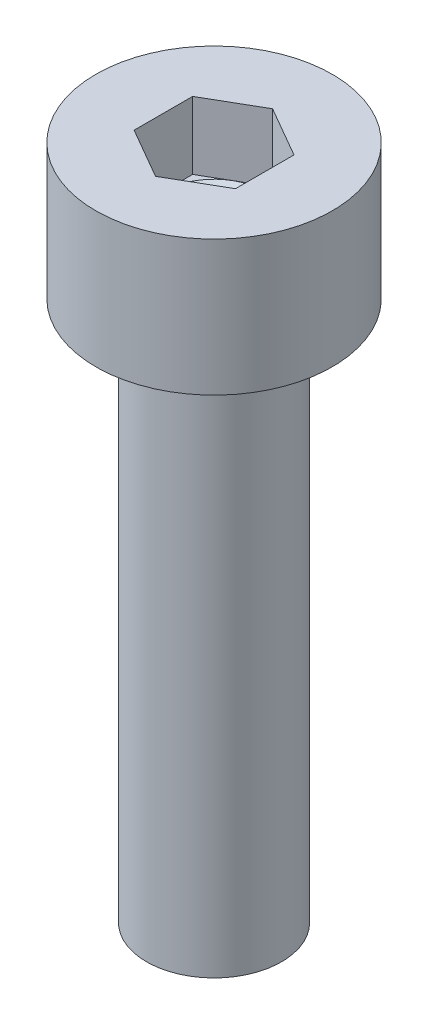
ISO-10303-21;
HEADER;
FILE_DESCRIPTION(('STEP AP214'),'2;1');
FILE_NAME('part.step','',(''),(''),'','','');
FILE_SCHEMA(('AUTOMOTIVE_DESIGN { 1 0 10303 214 1 1 1 1 }'));
ENDSEC;
DATA;
#1=APPLICATION_CONTEXT('core data for automotive mechanical design processes');
#2=APPLICATION_PROTOCOL_DEFINITION('international standard','automotive_design',2000,#1);
#3=PRODUCT_CONTEXT('',#1,'mechanical');
#4=PRODUCT('Part','Part','',(#3));
#5=PRODUCT_RELATED_PRODUCT_CATEGORY('part','',(#4));
#6=PRODUCT_DEFINITION_FORMATION('','',#4);
#7=PRODUCT_DEFINITION_CONTEXT('part definition',#1,'design');
#8=PRODUCT_DEFINITION('design','',#6,#7);
#9=PRODUCT_DEFINITION_SHAPE('','',#8);
#10=(LENGTH_UNIT() NAMED_UNIT(*) SI_UNIT(.MILLI.,.METRE.));
#11=(NAMED_UNIT(*) PLANE_ANGLE_UNIT() SI_UNIT($,.RADIAN.));
#12=(NAMED_UNIT(*) SI_UNIT($,.STERADIAN.) SOLID_ANGLE_UNIT());
#13=UNCERTAINTY_MEASURE_WITH_UNIT(LENGTH_MEASURE(1.E-05),#10,'distance_accuracy_value','');
#14=(GEOMETRIC_REPRESENTATION_CONTEXT(3) GLOBAL_UNCERTAINTY_ASSIGNED_CONTEXT((#13)) GLOBAL_UNIT_ASSIGNED_CONTEXT((#10,
#11,#12)) REPRESENTATION_CONTEXT('',''));
#15=CARTESIAN_POINT('',(0.,0.,0.));
#16=DIRECTION('',(0.,0.,1.));
#17=DIRECTION('',(1.,0.,0.));
#18=AXIS2_PLACEMENT_3D('',#15,#16,#17);
#19=CARTESIAN_POINT('',(0.,0.,0.));
#20=DIRECTION('',(0.,-1.,0.));
#21=DIRECTION('',(1.,0.,0.));
#22=AXIS2_PLACEMENT_3D('',#19,#20,#21);
#23=PLANE('',#22);
#24=CARTESIAN_POINT('',(0.,0.,0.));
#25=DIRECTION('',(0.,1.,0.));
#26=DIRECTION('',(-1.,0.,0.));
#27=AXIS2_PLACEMENT_3D('',#24,#25,#26);
#28=CIRCLE('',#27,3.5);
#29=CARTESIAN_POINT('',(-3.5,0.,0.));
#30=VERTEX_POINT('',#29);
#31=EDGE_CURVE('E11',#30,#30,#28,.T.);
#32=ORIENTED_EDGE('',*,*,#31,.T.);
#33=EDGE_LOOP('',(#32));
#34=FACE_BOUND('',#33,.T.);
#35=DIRECTION('',(-0.866025403784439,0.,0.5));
#36=VECTOR('',#35,1.);
#37=CARTESIAN_POINT('',(0.,0.,-1.73205080756888));
#38=LINE('',#37,#36);
#39=CARTESIAN_POINT('',(0.,0.,-1.73205080756888));
#40=VERTEX_POINT('',#39);
#41=CARTESIAN_POINT('',(-1.5,0.,-0.866025403784439));
#42=VERTEX_POINT('',#41);
#43=EDGE_CURVE('E148',#40,#42,#38,.T.);
#44=ORIENTED_EDGE('',*,*,#43,.F.);
#45=DIRECTION('',(-0.866025403784439,0.,-0.5));
#46=VECTOR('',#45,1.);
#47=CARTESIAN_POINT('',(1.5,0.,-0.866025403784439));
#48=LINE('',#47,#46);
#49=CARTESIAN_POINT('',(1.5,0.,-0.866025403784439));
#50=VERTEX_POINT('',#49);
#51=EDGE_CURVE('E49',#50,#40,#48,.T.);
#52=ORIENTED_EDGE('',*,*,#51,.F.);
#53=DIRECTION('',(0.,0.,-1.));
#54=VECTOR('',#53,1.);
#55=CARTESIAN_POINT('',(1.5,0.,0.866025403784439));
#56=LINE('',#55,#54);
#57=CARTESIAN_POINT('',(1.5,0.,0.866025403784439));
#58=VERTEX_POINT('',#57);
#59=EDGE_CURVE('E119',#58,#50,#56,.T.);
#60=ORIENTED_EDGE('',*,*,#59,.F.);
#61=DIRECTION('',(0.866025403784439,0.,-0.5));
#62=VECTOR('',#61,1.);
#63=CARTESIAN_POINT('',(0.,0.,1.73205080756888));
#64=LINE('',#63,#62);
#65=CARTESIAN_POINT('',(0.,0.,1.73205080756888));
#66=VERTEX_POINT('',#65);
#67=EDGE_CURVE('E155',#66,#58,#64,.T.);
#68=ORIENTED_EDGE('',*,*,#67,.F.);
#69=DIRECTION('',(0.866025403784439,0.,0.5));
#70=VECTOR('',#69,1.);
#71=CARTESIAN_POINT('',(-1.5,0.,0.866025403784439));
#72=LINE('',#71,#70);
#73=CARTESIAN_POINT('',(-1.5,0.,0.866025403784439));
#74=VERTEX_POINT('',#73);
#75=EDGE_CURVE('E152',#74,#66,#72,.T.);
#76=ORIENTED_EDGE('',*,*,#75,.F.);
#77=DIRECTION('',(0.,0.,1.));
#78=VECTOR('',#77,1.);
#79=CARTESIAN_POINT('',(-1.5,0.,-0.866025403784439));
#80=LINE('',#79,#78);
#81=EDGE_CURVE('E150',#42,#74,#80,.T.);
#82=ORIENTED_EDGE('',*,*,#81,.F.);
#83=EDGE_LOOP('',(#44,#52,#60,#68,#76,#82));
#84=FACE_BOUND('',#83,.T.);
#85=ADVANCED_FACE('F35',(#34,#84),#23,.F.);
#86=CARTESIAN_POINT('',(0.,0.,0.));
#87=DIRECTION('',(0.,1.,0.));
#88=DIRECTION('',(-1.,0.,0.));
#89=AXIS2_PLACEMENT_3D('',#86,#87,#88);
#90=CYLINDRICAL_SURFACE('',#89,3.5);
#91=ORIENTED_EDGE('',*,*,#31,.F.);
#92=EDGE_LOOP('',(#91));
#93=FACE_BOUND('',#92,.T.);
#94=CARTESIAN_POINT('',(0.,-4.,0.));
#95=DIRECTION('',(0.,1.,0.));
#96=DIRECTION('',(-1.,0.,0.));
#97=AXIS2_PLACEMENT_3D('',#94,#95,#96);
#98=CIRCLE('',#97,3.5);
#99=CARTESIAN_POINT('',(-3.5,-4.,0.));
#100=VERTEX_POINT('',#99);
#101=EDGE_CURVE('E42',#100,#100,#98,.T.);
#102=ORIENTED_EDGE('',*,*,#101,.T.);
#103=EDGE_LOOP('',(#102));
#104=FACE_BOUND('',#103,.T.);
#105=ADVANCED_FACE('F184',(#93,#104),#90,.T.);
#106=CARTESIAN_POINT('',(3.5,-4.,0.));
#107=DIRECTION('',(0.,1.,0.));
#108=DIRECTION('',(-1.,0.,0.));
#109=AXIS2_PLACEMENT_3D('',#106,#107,#108);
#110=PLANE('',#109);
#111=ORIENTED_EDGE('',*,*,#101,.F.);
#112=EDGE_LOOP('',(#111));
#113=FACE_BOUND('',#112,.T.);
#114=CARTESIAN_POINT('',(0.,-4.,0.));
#115=DIRECTION('',(0.,1.,0.));
#116=DIRECTION('',(-1.,0.,0.));
#117=AXIS2_PLACEMENT_3D('',#114,#115,#116);
#118=CIRCLE('',#117,2.);
#119=CARTESIAN_POINT('',(-2.,-4.,0.));
#120=VERTEX_POINT('',#119);
#121=EDGE_CURVE('E179',#120,#120,#118,.T.);
#122=ORIENTED_EDGE('',*,*,#121,.T.);
#123=EDGE_LOOP('',(#122));
#124=FACE_BOUND('',#123,.T.);
#125=ADVANCED_FACE('F186',(#113,#124),#110,.F.);
#126=CARTESIAN_POINT('',(0.,0.,0.));
#127=DIRECTION('',(0.,1.,0.));
#128=DIRECTION('',(-1.,0.,0.));
#129=AXIS2_PLACEMENT_3D('',#126,#127,#128);
#130=CYLINDRICAL_SURFACE('',#129,2.);
#131=ORIENTED_EDGE('',*,*,#121,.F.);
#132=EDGE_LOOP('',(#131));
#133=FACE_BOUND('',#132,.T.);
#134=CARTESIAN_POINT('',(0.,-20.,0.));
#135=DIRECTION('',(0.,1.,0.));
#136=DIRECTION('',(-1.,0.,0.));
#137=AXIS2_PLACEMENT_3D('',#134,#135,#136);
#138=CIRCLE('',#137,2.);
#139=CARTESIAN_POINT('',(-2.,-20.,0.));
#140=VERTEX_POINT('',#139);
#141=EDGE_CURVE('E175',#140,#140,#138,.T.);
#142=ORIENTED_EDGE('',*,*,#141,.T.);
#143=EDGE_LOOP('',(#142));
#144=FACE_BOUND('',#143,.T.);
#145=ADVANCED_FACE('F189',(#133,#144),#130,.T.);
#146=CARTESIAN_POINT('',(2.,-20.,0.));
#147=DIRECTION('',(0.,1.,0.));
#148=DIRECTION('',(-1.,0.,0.));
#149=AXIS2_PLACEMENT_3D('',#146,#147,#148);
#150=PLANE('',#149);
#151=ORIENTED_EDGE('',*,*,#141,.F.);
#152=EDGE_LOOP('',(#151));
#153=FACE_BOUND('',#152,.T.);
#154=ADVANCED_FACE('F195',(#153),#150,.F.);
#155=CARTESIAN_POINT('',(1.5,-2.,-0.866025403784439));
#156=DIRECTION('',(0.5,0.,-0.866025403784439));
#157=DIRECTION('',(-0.866025403784439,0.,-0.5));
#158=AXIS2_PLACEMENT_3D('',#155,#156,#157);
#159=PLANE('',#158);
#160=DIRECTION('',(-0.866025403784439,0.,-0.5));
#161=VECTOR('',#160,1.);
#162=CARTESIAN_POINT('',(1.5,-2.,-0.866025403784439));
#163=LINE('',#162,#161);
#164=CARTESIAN_POINT('',(1.5,-2.,-0.866025403784439));
#165=VERTEX_POINT('',#164);
#166=CARTESIAN_POINT('',(0.75,-2.,-1.29903810567666));
#167=VERTEX_POINT('',#166);
#168=EDGE_CURVE('E118',#165,#167,#163,.T.);
#169=ORIENTED_EDGE('',*,*,#168,.F.);
#170=DIRECTION('',(0.,1.,0.));
#171=VECTOR('',#170,1.);
#172=CARTESIAN_POINT('',(1.5,-2.,-0.866025403784439));
#173=LINE('',#172,#171);
#174=EDGE_CURVE('E158',#165,#50,#173,.T.);
#175=ORIENTED_EDGE('',*,*,#174,.T.);
#176=ORIENTED_EDGE('',*,*,#51,.T.);
#177=DIRECTION('',(0.,1.,0.));
#178=VECTOR('',#177,1.);
#179=CARTESIAN_POINT('',(0.,-2.,-1.73205080756888));
#180=LINE('',#179,#178);
#181=CARTESIAN_POINT('',(0.,-2.,-1.73205080756888));
#182=VERTEX_POINT('',#181);
#183=EDGE_CURVE('E121',#182,#40,#180,.T.);
#184=ORIENTED_EDGE('',*,*,#183,.F.);
#185=EDGE_CURVE('E110',#167,#182,#163,.T.);
#186=ORIENTED_EDGE('',*,*,#185,.F.);
#187=EDGE_LOOP('',(#169,#175,#176,#184,#186));
#188=FACE_BOUND('',#187,.T.);
#189=ADVANCED_FACE('F122',(#188),#159,.F.);
#190=CARTESIAN_POINT('',(1.5,-2.,0.866025403784439));
#191=DIRECTION('',(1.,0.,0.));
#192=DIRECTION('',(0.,0.,-1.));
#193=AXIS2_PLACEMENT_3D('',#190,#191,#192);
#194=PLANE('',#193);
#195=DIRECTION('',(0.,0.,-1.));
#196=VECTOR('',#195,1.);
#197=CARTESIAN_POINT('',(1.5,-2.,0.866025403784439));
#198=LINE('',#197,#196);
#199=CARTESIAN_POINT('',(1.5,-2.,0.866025403784439));
#200=VERTEX_POINT('',#199);
#201=CARTESIAN_POINT('',(1.5,-2.,0.));
#202=VERTEX_POINT('',#201);
#203=EDGE_CURVE('E126',#200,#202,#198,.T.);
#204=ORIENTED_EDGE('',*,*,#203,.F.);
#205=DIRECTION('',(0.,1.,0.));
#206=VECTOR('',#205,1.);
#207=CARTESIAN_POINT('',(1.5,-2.,0.866025403784439));
#208=LINE('',#207,#206);
#209=EDGE_CURVE('E161',#200,#58,#208,.T.);
#210=ORIENTED_EDGE('',*,*,#209,.T.);
#211=ORIENTED_EDGE('',*,*,#59,.T.);
#212=ORIENTED_EDGE('',*,*,#174,.F.);
#213=EDGE_CURVE('E144',#202,#165,#198,.T.);
#214=ORIENTED_EDGE('',*,*,#213,.F.);
#215=EDGE_LOOP('',(#204,#210,#211,#212,#214));
#216=FACE_BOUND('',#215,.T.);
#217=ADVANCED_FACE('F204',(#216),#194,.F.);
#218=CARTESIAN_POINT('',(0.,-2.,1.73205080756888));
#219=DIRECTION('',(0.5,0.,0.866025403784439));
#220=DIRECTION('',(0.866025403784439,0.,-0.5));
#221=AXIS2_PLACEMENT_3D('',#218,#219,#220);
#222=PLANE('',#221);
#223=DIRECTION('',(0.866025403784439,0.,-0.5));
#224=VECTOR('',#223,1.);
#225=CARTESIAN_POINT('',(0.,-2.,1.73205080756888));
#226=LINE('',#225,#224);
#227=CARTESIAN_POINT('',(0.,-2.,1.73205080756888));
#228=VERTEX_POINT('',#227);
#229=CARTESIAN_POINT('',(0.75,-2.,1.29903810567666));
#230=VERTEX_POINT('',#229);
#231=EDGE_CURVE('E57',#228,#230,#226,.T.);
#232=ORIENTED_EDGE('',*,*,#231,.F.);
#233=DIRECTION('',(0.,1.,0.));
#234=VECTOR('',#233,1.);
#235=CARTESIAN_POINT('',(0.,-2.,1.73205080756888));
#236=LINE('',#235,#234);
#237=EDGE_CURVE('E164',#228,#66,#236,.T.);
#238=ORIENTED_EDGE('',*,*,#237,.T.);
#239=ORIENTED_EDGE('',*,*,#67,.T.);
#240=ORIENTED_EDGE('',*,*,#209,.F.);
#241=EDGE_CURVE('E142',#230,#200,#226,.T.);
#242=ORIENTED_EDGE('',*,*,#241,.F.);
#243=EDGE_LOOP('',(#232,#238,#239,#240,#242));
#244=FACE_BOUND('',#243,.T.);
#245=ADVANCED_FACE('F245',(#244),#222,.F.);
#246=CARTESIAN_POINT('',(-1.5,-2.,0.866025403784439));
#247=DIRECTION('',(-0.5,0.,0.866025403784439));
#248=DIRECTION('',(0.866025403784439,0.,0.5));
#249=AXIS2_PLACEMENT_3D('',#246,#247,#248);
#250=PLANE('',#249);
#251=DIRECTION('',(0.866025403784439,0.,0.5));
#252=VECTOR('',#251,1.);
#253=CARTESIAN_POINT('',(-1.5,-2.,0.866025403784439));
#254=LINE('',#253,#252);
#255=CARTESIAN_POINT('',(-1.5,-2.,0.866025403784439));
#256=VERTEX_POINT('',#255);
#257=CARTESIAN_POINT('',(-0.75,-2.,1.29903810567666));
#258=VERTEX_POINT('',#257);
#259=EDGE_CURVE('E139',#256,#258,#254,.T.);
#260=ORIENTED_EDGE('',*,*,#259,.F.);
#261=DIRECTION('',(0.,1.,0.));
#262=VECTOR('',#261,1.);
#263=CARTESIAN_POINT('',(-1.5,-2.,0.866025403784439));
#264=LINE('',#263,#262);
#265=EDGE_CURVE('E167',#256,#74,#264,.T.);
#266=ORIENTED_EDGE('',*,*,#265,.T.);
#267=ORIENTED_EDGE('',*,*,#75,.T.);
#268=ORIENTED_EDGE('',*,*,#237,.F.);
#269=EDGE_CURVE('E138',#258,#228,#254,.T.);
#270=ORIENTED_EDGE('',*,*,#269,.F.);
#271=EDGE_LOOP('',(#260,#266,#267,#268,#270));
#272=FACE_BOUND('',#271,.T.);
#273=ADVANCED_FACE('F240',(#272),#250,.F.);
#274=CARTESIAN_POINT('',(-1.5,-2.,-0.866025403784439));
#275=DIRECTION('',(-1.,0.,0.));
#276=DIRECTION('',(0.,0.,1.));
#277=AXIS2_PLACEMENT_3D('',#274,#275,#276);
#278=PLANE('',#277);
#279=DIRECTION('',(0.,0.,1.));
#280=VECTOR('',#279,1.);
#281=CARTESIAN_POINT('',(-1.5,-2.,-0.866025403784439));
#282=LINE('',#281,#280);
#283=CARTESIAN_POINT('',(-1.5,-2.,-0.866025403784439));
#284=VERTEX_POINT('',#283);
#285=CARTESIAN_POINT('',(-1.5,-2.,0.));
#286=VERTEX_POINT('',#285);
#287=EDGE_CURVE('E134',#284,#286,#282,.T.);
#288=ORIENTED_EDGE('',*,*,#287,.F.);
#289=DIRECTION('',(0.,1.,0.));
#290=VECTOR('',#289,1.);
#291=CARTESIAN_POINT('',(-1.5,-2.,-0.866025403784439));
#292=LINE('',#291,#290);
#293=EDGE_CURVE('E125',#284,#42,#292,.T.);
#294=ORIENTED_EDGE('',*,*,#293,.T.);
#295=ORIENTED_EDGE('',*,*,#81,.T.);
#296=ORIENTED_EDGE('',*,*,#265,.F.);
#297=EDGE_CURVE('E132',#286,#256,#282,.T.);
#298=ORIENTED_EDGE('',*,*,#297,.F.);
#299=EDGE_LOOP('',(#288,#294,#295,#296,#298));
#300=FACE_BOUND('',#299,.T.);
#301=ADVANCED_FACE('F220',(#300),#278,.F.);
#302=CARTESIAN_POINT('',(0.,-2.,-1.73205080756888));
#303=DIRECTION('',(-0.5,0.,-0.866025403784439));
#304=DIRECTION('',(-0.866025403784439,0.,0.5));
#305=AXIS2_PLACEMENT_3D('',#302,#303,#304);
#306=PLANE('',#305);
#307=DIRECTION('',(-0.866025403784439,0.,0.5));
#308=VECTOR('',#307,1.);
#309=CARTESIAN_POINT('',(0.,-2.,-1.73205080756888));
#310=LINE('',#309,#308);
#311=CARTESIAN_POINT('',(-0.75,-2.,-1.29903810567666));
#312=VERTEX_POINT('',#311);
#313=EDGE_CURVE('E113',#182,#312,#310,.T.);
#314=ORIENTED_EDGE('',*,*,#313,.F.);
#315=ORIENTED_EDGE('',*,*,#183,.T.);
#316=ORIENTED_EDGE('',*,*,#43,.T.);
#317=ORIENTED_EDGE('',*,*,#293,.F.);
#318=EDGE_CURVE('E131',#312,#284,#310,.T.);
#319=ORIENTED_EDGE('',*,*,#318,.F.);
#320=EDGE_LOOP('',(#314,#315,#316,#317,#319));
#321=FACE_BOUND('',#320,.T.);
#322=ADVANCED_FACE('F129',(#321),#306,.F.);
#323=CARTESIAN_POINT('',(0.,-2.,0.));
#324=DIRECTION('',(0.,1.,0.));
#325=DIRECTION('',(0.,0.,1.));
#326=AXIS2_PLACEMENT_3D('',#323,#324,#325);
#327=PLANE('',#326);
#328=ORIENTED_EDGE('',*,*,#241,.T.);
#329=ORIENTED_EDGE('',*,*,#203,.T.);
#330=CARTESIAN_POINT('',(0.,-2.,0.));
#331=DIRECTION('',(0.,1.,0.));
#332=DIRECTION('',(-1.,0.,0.));
#333=AXIS2_PLACEMENT_3D('',#330,#331,#332);
#334=CIRCLE('',#333,1.5);
#335=EDGE_CURVE('E232',#230,#202,#334,.T.);
#336=ORIENTED_EDGE('',*,*,#335,.F.);
#337=EDGE_LOOP('',(#328,#329,#336));
#338=FACE_BOUND('',#337,.T.);
#339=ADVANCED_FACE('F251',(#338),#327,.T.);
#340=ORIENTED_EDGE('',*,*,#213,.T.);
#341=ORIENTED_EDGE('',*,*,#168,.T.);
#342=EDGE_CURVE('E231',#202,#167,#334,.T.);
#343=ORIENTED_EDGE('',*,*,#342,.F.);
#344=EDGE_LOOP('',(#340,#341,#343));
#345=FACE_BOUND('',#344,.T.);
#346=ADVANCED_FACE('F253',(#345),#327,.T.);
#347=ORIENTED_EDGE('',*,*,#185,.T.);
#348=ORIENTED_EDGE('',*,*,#313,.T.);
#349=EDGE_CURVE('E115',#167,#312,#334,.T.);
#350=ORIENTED_EDGE('',*,*,#349,.F.);
#351=EDGE_LOOP('',(#347,#348,#350));
#352=FACE_BOUND('',#351,.T.);
#353=ADVANCED_FACE('F111',(#352),#327,.T.);
#354=ORIENTED_EDGE('',*,*,#318,.T.);
#355=ORIENTED_EDGE('',*,*,#287,.T.);
#356=EDGE_CURVE('E160',#312,#286,#334,.T.);
#357=ORIENTED_EDGE('',*,*,#356,.F.);
#358=EDGE_LOOP('',(#354,#355,#357));
#359=FACE_BOUND('',#358,.T.);
#360=ADVANCED_FACE('F225',(#359),#327,.T.);
#361=ORIENTED_EDGE('',*,*,#297,.T.);
#362=ORIENTED_EDGE('',*,*,#259,.T.);
#363=EDGE_CURVE('E172',#286,#258,#334,.T.);
#364=ORIENTED_EDGE('',*,*,#363,.F.);
#365=EDGE_LOOP('',(#361,#362,#364));
#366=FACE_BOUND('',#365,.T.);
#367=ADVANCED_FACE('F242',(#366),#327,.T.);
#368=ORIENTED_EDGE('',*,*,#269,.T.);
#369=ORIENTED_EDGE('',*,*,#231,.T.);
#370=EDGE_CURVE('E176',#258,#230,#334,.T.);
#371=ORIENTED_EDGE('',*,*,#370,.F.);
#372=EDGE_LOOP('',(#368,#369,#371));
#373=FACE_BOUND('',#372,.T.);
#374=ADVANCED_FACE('F236',(#373),#327,.T.);
#375=CARTESIAN_POINT('',(0.,-2.86602540378446,0.));
#376=DIRECTION('',(0.,1.,0.));
#377=DIRECTION('',(-1.,0.,0.));
#378=AXIS2_PLACEMENT_3D('',#375,#376,#377);
#379=CONICAL_SURFACE('',#378,0.,1.04719755119659);
#380=ORIENTED_EDGE('',*,*,#363,.T.);
#381=ORIENTED_EDGE('',*,*,#370,.T.);
#382=ORIENTED_EDGE('',*,*,#335,.T.);
#383=ORIENTED_EDGE('',*,*,#342,.T.);
#384=ORIENTED_EDGE('',*,*,#349,.T.);
#385=ORIENTED_EDGE('',*,*,#356,.T.);
#386=EDGE_LOOP('',(#380,#381,#382,#383,#384,#385));
#387=FACE_BOUND('',#386,.T.);
#388=CARTESIAN_POINT('',(0.,-2.86602540378446,0.));
#389=VERTEX_POINT('',#388);
#390=VERTEX_LOOP('',#389);
#391=FACE_BOUND('',#390,.T.);
#392=ADVANCED_FACE('F227',(#387,#391),#379,.F.);
#393=CLOSED_SHELL('',(#85,#105,#125,#145,#154,#189,#217,#245,#273,#301,#322,#339,#346,#353,#360,
#367,#374,#392));
#394=MANIFOLD_SOLID_BREP('B2',#393);
#395=ADVANCED_BREP_SHAPE_REPRESENTATION('',(#18,#394),#14);
#396=SHAPE_DEFINITION_REPRESENTATION(#9,#395);
ENDSEC;
END-ISO-10303-21;
